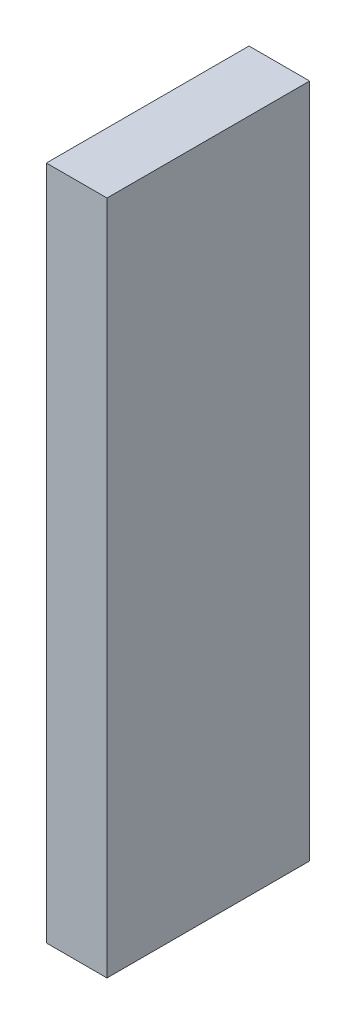
ISO-10303-21;
HEADER;
FILE_DESCRIPTION(('STEP AP214'),'2;1');
FILE_NAME('part.step','',(''),(''),'','','');
FILE_SCHEMA(('AUTOMOTIVE_DESIGN { 1 0 10303 214 1 1 1 1 }'));
ENDSEC;
DATA;
#1=APPLICATION_CONTEXT('core data for automotive mechanical design processes');
#2=APPLICATION_PROTOCOL_DEFINITION('international standard','automotive_design',2000,#1);
#3=PRODUCT_CONTEXT('',#1,'mechanical');
#4=PRODUCT('Part','Part','',(#3));
#5=PRODUCT_RELATED_PRODUCT_CATEGORY('part','',(#4));
#6=PRODUCT_DEFINITION_FORMATION('','',#4);
#7=PRODUCT_DEFINITION_CONTEXT('part definition',#1,'design');
#8=PRODUCT_DEFINITION('design','',#6,#7);
#9=PRODUCT_DEFINITION_SHAPE('','',#8);
#10=(LENGTH_UNIT() NAMED_UNIT(*) SI_UNIT(.MILLI.,.METRE.));
#11=(NAMED_UNIT(*) PLANE_ANGLE_UNIT() SI_UNIT($,.RADIAN.));
#12=(NAMED_UNIT(*) SI_UNIT($,.STERADIAN.) SOLID_ANGLE_UNIT());
#13=UNCERTAINTY_MEASURE_WITH_UNIT(LENGTH_MEASURE(1.E-05),#10,'distance_accuracy_value','');
#14=(GEOMETRIC_REPRESENTATION_CONTEXT(3) GLOBAL_UNCERTAINTY_ASSIGNED_CONTEXT((#13)) GLOBAL_UNIT_ASSIGNED_CONTEXT((#10,
#11,#12)) REPRESENTATION_CONTEXT('',''));
#15=CARTESIAN_POINT('',(0.,0.,0.));
#16=DIRECTION('',(0.,0.,1.));
#17=DIRECTION('',(1.,0.,0.));
#18=AXIS2_PLACEMENT_3D('',#15,#16,#17);
#19=CARTESIAN_POINT('',(-55.4324653258695,-22.8701190762308,1.5));
#20=DIRECTION('',(-1.,0.,0.));
#21=DIRECTION('',(0.,0.,1.));
#22=AXIS2_PLACEMENT_3D('',#19,#20,#21);
#23=PLANE('',#22);
#24=DIRECTION('',(0.,1.,0.));
#25=VECTOR('',#24,1.);
#26=CARTESIAN_POINT('',(-55.4324653258695,-22.8701190762308,0.));
#27=LINE('',#26,#25);
#28=CARTESIAN_POINT('',(-55.4324653258695,-22.8701190762308,0.));
#29=VERTEX_POINT('',#28);
#30=CARTESIAN_POINT('',(-55.4324653258695,-17.8701190762308,0.));
#31=VERTEX_POINT('',#30);
#32=EDGE_CURVE('E97',#29,#31,#27,.T.);
#33=ORIENTED_EDGE('',*,*,#32,.F.);
#34=DIRECTION('',(0.,0.,-1.));
#35=VECTOR('',#34,1.);
#36=CARTESIAN_POINT('',(-55.4324653258695,-22.8701190762308,1.5));
#37=LINE('',#36,#35);
#38=CARTESIAN_POINT('',(-55.4324653258695,-22.8701190762308,1.5));
#39=VERTEX_POINT('',#38);
#40=EDGE_CURVE('E11',#39,#29,#37,.T.);
#41=ORIENTED_EDGE('',*,*,#40,.F.);
#42=DIRECTION('',(0.,1.,0.));
#43=VECTOR('',#42,1.);
#44=CARTESIAN_POINT('',(-55.4324653258695,-22.8701190762308,1.5));
#45=LINE('',#44,#43);
#46=CARTESIAN_POINT('',(-55.4324653258695,-17.8701190762308,1.5));
#47=VERTEX_POINT('',#46);
#48=EDGE_CURVE('E91',#39,#47,#45,.T.);
#49=ORIENTED_EDGE('',*,*,#48,.T.);
#50=DIRECTION('',(0.,0.,-1.));
#51=VECTOR('',#50,1.);
#52=CARTESIAN_POINT('',(-55.4324653258695,-17.8701190762308,1.5));
#53=LINE('',#52,#51);
#54=EDGE_CURVE('E36',#47,#31,#53,.T.);
#55=ORIENTED_EDGE('',*,*,#54,.T.);
#56=EDGE_LOOP('',(#33,#41,#49,#55));
#57=FACE_BOUND('',#56,.T.);
#58=ADVANCED_FACE('F33',(#57),#23,.T.);
#59=CARTESIAN_POINT('',(-54.9837473771516,-22.8701190762308,1.5));
#60=DIRECTION('',(0.,-1.,0.));
#61=DIRECTION('',(0.,0.,-1.));
#62=AXIS2_PLACEMENT_3D('',#59,#60,#61);
#63=PLANE('',#62);
#64=DIRECTION('',(-1.,0.,0.));
#65=VECTOR('',#64,1.);
#66=CARTESIAN_POINT('',(-54.9837473771516,-22.8701190762308,0.));
#67=LINE('',#66,#65);
#68=CARTESIAN_POINT('',(-54.9837473771516,-22.8701190762308,0.));
#69=VERTEX_POINT('',#68);
#70=EDGE_CURVE('E93',#69,#29,#67,.T.);
#71=ORIENTED_EDGE('',*,*,#70,.F.);
#72=DIRECTION('',(0.,0.,-1.));
#73=VECTOR('',#72,1.);
#74=CARTESIAN_POINT('',(-54.9837473771516,-22.8701190762308,1.5));
#75=LINE('',#74,#73);
#76=CARTESIAN_POINT('',(-54.9837473771516,-22.8701190762308,1.5));
#77=VERTEX_POINT('',#76);
#78=EDGE_CURVE('E42',#77,#69,#75,.T.);
#79=ORIENTED_EDGE('',*,*,#78,.F.);
#80=DIRECTION('',(-1.,0.,0.));
#81=VECTOR('',#80,1.);
#82=CARTESIAN_POINT('',(-54.9837473771516,-22.8701190762308,1.5));
#83=LINE('',#82,#81);
#84=EDGE_CURVE('E88',#77,#39,#83,.T.);
#85=ORIENTED_EDGE('',*,*,#84,.T.);
#86=ORIENTED_EDGE('',*,*,#40,.T.);
#87=EDGE_LOOP('',(#71,#79,#85,#86));
#88=FACE_BOUND('',#87,.T.);
#89=ADVANCED_FACE('F107',(#88),#63,.T.);
#90=CARTESIAN_POINT('',(-54.9837473771516,-17.8701190762308,1.5));
#91=DIRECTION('',(1.,0.,0.));
#92=DIRECTION('',(0.,0.,-1.));
#93=AXIS2_PLACEMENT_3D('',#90,#91,#92);
#94=PLANE('',#93);
#95=DIRECTION('',(0.,-1.,0.));
#96=VECTOR('',#95,1.);
#97=CARTESIAN_POINT('',(-54.9837473771516,-17.8701190762308,0.));
#98=LINE('',#97,#96);
#99=CARTESIAN_POINT('',(-54.9837473771516,-17.8701190762308,0.));
#100=VERTEX_POINT('',#99);
#101=EDGE_CURVE('E83',#100,#69,#98,.T.);
#102=ORIENTED_EDGE('',*,*,#101,.F.);
#103=DIRECTION('',(0.,0.,-1.));
#104=VECTOR('',#103,1.);
#105=CARTESIAN_POINT('',(-54.9837473771516,-17.8701190762308,1.5));
#106=LINE('',#105,#104);
#107=CARTESIAN_POINT('',(-54.9837473771516,-17.8701190762308,1.5));
#108=VERTEX_POINT('',#107);
#109=EDGE_CURVE('E78',#108,#100,#106,.T.);
#110=ORIENTED_EDGE('',*,*,#109,.F.);
#111=DIRECTION('',(0.,-1.,0.));
#112=VECTOR('',#111,1.);
#113=CARTESIAN_POINT('',(-54.9837473771516,-17.8701190762308,1.5));
#114=LINE('',#113,#112);
#115=EDGE_CURVE('E81',#108,#77,#114,.T.);
#116=ORIENTED_EDGE('',*,*,#115,.T.);
#117=ORIENTED_EDGE('',*,*,#78,.T.);
#118=EDGE_LOOP('',(#102,#110,#116,#117));
#119=FACE_BOUND('',#118,.T.);
#120=ADVANCED_FACE('F80',(#119),#94,.T.);
#121=CARTESIAN_POINT('',(-55.4324653258695,-17.8701190762308,1.5));
#122=DIRECTION('',(0.,1.,0.));
#123=DIRECTION('',(0.,0.,1.));
#124=AXIS2_PLACEMENT_3D('',#121,#122,#123);
#125=PLANE('',#124);
#126=DIRECTION('',(1.,0.,0.));
#127=VECTOR('',#126,1.);
#128=CARTESIAN_POINT('',(-55.4324653258695,-17.8701190762308,0.));
#129=LINE('',#128,#127);
#130=EDGE_CURVE('E100',#31,#100,#129,.T.);
#131=ORIENTED_EDGE('',*,*,#130,.F.);
#132=ORIENTED_EDGE('',*,*,#54,.F.);
#133=DIRECTION('',(1.,0.,0.));
#134=VECTOR('',#133,1.);
#135=CARTESIAN_POINT('',(-55.4324653258695,-17.8701190762308,1.5));
#136=LINE('',#135,#134);
#137=EDGE_CURVE('E87',#47,#108,#136,.T.);
#138=ORIENTED_EDGE('',*,*,#137,.T.);
#139=ORIENTED_EDGE('',*,*,#109,.T.);
#140=EDGE_LOOP('',(#131,#132,#138,#139));
#141=FACE_BOUND('',#140,.T.);
#142=ADVANCED_FACE('F90',(#141),#125,.T.);
#143=CARTESIAN_POINT('',(0.,0.,1.5));
#144=DIRECTION('',(0.,0.,-1.));
#145=DIRECTION('',(-1.,0.,0.));
#146=AXIS2_PLACEMENT_3D('',#143,#144,#145);
#147=PLANE('',#146);
#148=ORIENTED_EDGE('',*,*,#48,.F.);
#149=ORIENTED_EDGE('',*,*,#84,.F.);
#150=ORIENTED_EDGE('',*,*,#115,.F.);
#151=ORIENTED_EDGE('',*,*,#137,.F.);
#152=EDGE_LOOP('',(#148,#149,#150,#151));
#153=FACE_BOUND('',#152,.T.);
#154=ADVANCED_FACE('F86',(#153),#147,.F.);
#155=CARTESIAN_POINT('',(0.,0.,0.));
#156=DIRECTION('',(0.,0.,-1.));
#157=DIRECTION('',(-1.,0.,0.));
#158=AXIS2_PLACEMENT_3D('',#155,#156,#157);
#159=PLANE('',#158);
#160=ORIENTED_EDGE('',*,*,#32,.T.);
#161=ORIENTED_EDGE('',*,*,#130,.T.);
#162=ORIENTED_EDGE('',*,*,#101,.T.);
#163=ORIENTED_EDGE('',*,*,#70,.T.);
#164=EDGE_LOOP('',(#160,#161,#162,#163));
#165=FACE_BOUND('',#164,.T.);
#166=ADVANCED_FACE('F106',(#165),#159,.T.);
#167=CLOSED_SHELL('',(#58,#89,#120,#142,#154,#166));
#168=MANIFOLD_SOLID_BREP('B2',#167);
#169=ADVANCED_BREP_SHAPE_REPRESENTATION('',(#18,#168),#14);
#170=SHAPE_DEFINITION_REPRESENTATION(#9,#169);
ENDSEC;
END-ISO-10303-21;
